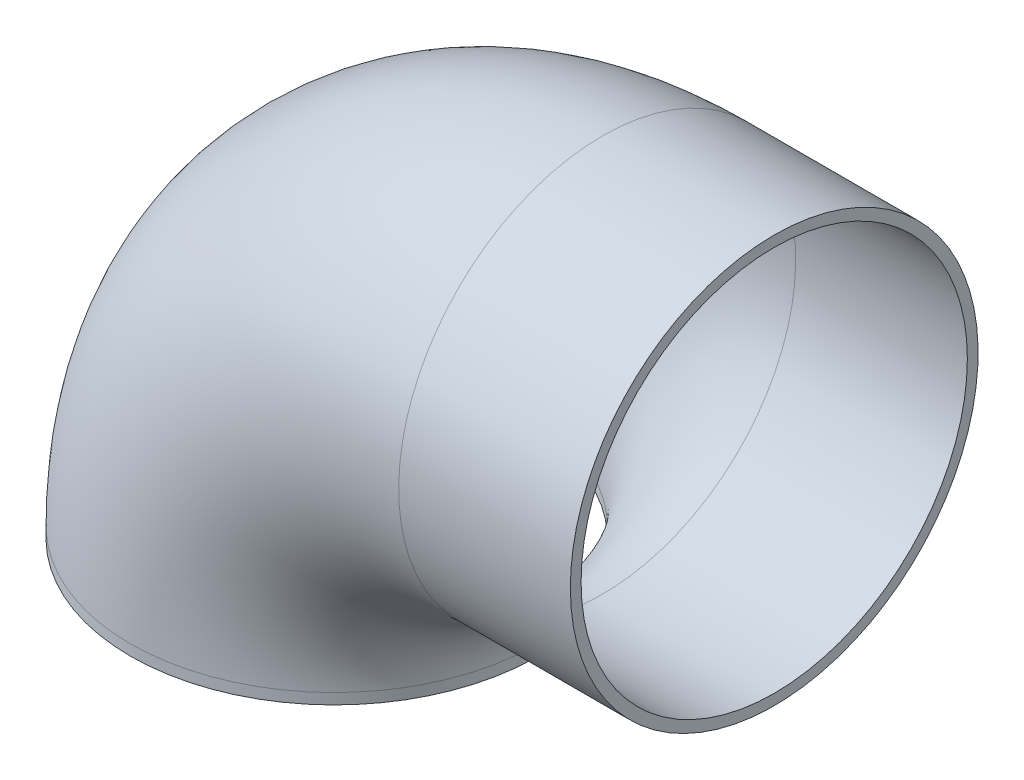
ISO-10303-21;
HEADER;
FILE_DESCRIPTION(('STEP AP214'),'2;1');
FILE_NAME('part.step','',(''),(''),'','','');
FILE_SCHEMA(('AUTOMOTIVE_DESIGN { 1 0 10303 214 1 1 1 1 }'));
ENDSEC;
DATA;
#1=APPLICATION_CONTEXT('core data for automotive mechanical design processes');
#2=APPLICATION_PROTOCOL_DEFINITION('international standard','automotive_design',2000,#1);
#3=PRODUCT_CONTEXT('',#1,'mechanical');
#4=PRODUCT('Part','Part','',(#3));
#5=PRODUCT_RELATED_PRODUCT_CATEGORY('part','',(#4));
#6=PRODUCT_DEFINITION_FORMATION('','',#4);
#7=PRODUCT_DEFINITION_CONTEXT('part definition',#1,'design');
#8=PRODUCT_DEFINITION('design','',#6,#7);
#9=PRODUCT_DEFINITION_SHAPE('','',#8);
#10=(LENGTH_UNIT() NAMED_UNIT(*) SI_UNIT(.MILLI.,.METRE.));
#11=(NAMED_UNIT(*) PLANE_ANGLE_UNIT() SI_UNIT($,.RADIAN.));
#12=(NAMED_UNIT(*) SI_UNIT($,.STERADIAN.) SOLID_ANGLE_UNIT());
#13=UNCERTAINTY_MEASURE_WITH_UNIT(LENGTH_MEASURE(1.E-05),#10,'distance_accuracy_value','');
#14=(GEOMETRIC_REPRESENTATION_CONTEXT(3) GLOBAL_UNCERTAINTY_ASSIGNED_CONTEXT((#13)) GLOBAL_UNIT_ASSIGNED_CONTEXT((#10,
#11,#12)) REPRESENTATION_CONTEXT('',''));
#15=CARTESIAN_POINT('',(0.,0.,0.));
#16=DIRECTION('',(0.,0.,1.));
#17=DIRECTION('',(1.,0.,0.));
#18=AXIS2_PLACEMENT_3D('',#15,#16,#17);
#19=CARTESIAN_POINT('',(0.,0.,0.));
#20=DIRECTION('',(0.,1.,0.));
#21=DIRECTION('',(0.,0.,1.));
#22=AXIS2_PLACEMENT_3D('',#19,#20,#21);
#23=CYLINDRICAL_SURFACE('',#22,38.);
#24=CARTESIAN_POINT('',(0.,1.99999999999999,0.));
#25=DIRECTION('',(0.,1.,0.));
#26=DIRECTION('',(0.,0.,1.));
#27=AXIS2_PLACEMENT_3D('',#24,#25,#26);
#28=CIRCLE('',#27,38.);
#29=CARTESIAN_POINT('',(-38.,1.99999999999999,0.));
#30=VERTEX_POINT('',#29);
#31=EDGE_CURVE('E79',#30,#30,#28,.T.);
#32=ORIENTED_EDGE('',*,*,#31,.F.);
#33=EDGE_LOOP('',(#32));
#34=FACE_BOUND('',#33,.T.);
#35=CARTESIAN_POINT('',(0.,0.,0.));
#36=DIRECTION('',(0.,1.,0.));
#37=DIRECTION('',(0.,0.,1.));
#38=AXIS2_PLACEMENT_3D('',#35,#36,#37);
#39=CIRCLE('',#38,38.);
#40=CARTESIAN_POINT('',(0.,0.,38.));
#41=VERTEX_POINT('',#40);
#42=EDGE_CURVE('E48',#41,#41,#39,.T.);
#43=ORIENTED_EDGE('',*,*,#42,.T.);
#44=EDGE_LOOP('',(#43));
#45=FACE_BOUND('',#44,.T.);
#46=ADVANCED_FACE('F33',(#34,#45),#23,.T.);
#47=CARTESIAN_POINT('',(50.,1.99999999999999,0.));
#48=DIRECTION('',(0.,0.,-1.));
#49=DIRECTION('',(-1.,0.,0.));
#50=AXIS2_PLACEMENT_3D('',#47,#48,#49);
#51=TOROIDAL_SURFACE('',#50,50.,38.);
#52=CARTESIAN_POINT('',(50.,52.,0.));
#53=DIRECTION('',(1.,0.,0.));
#54=DIRECTION('',(0.,0.,1.));
#55=AXIS2_PLACEMENT_3D('',#52,#53,#54);
#56=CIRCLE('',#55,38.);
#57=CARTESIAN_POINT('',(50.,90.,0.));
#58=VERTEX_POINT('',#57);
#59=EDGE_CURVE('E37',#58,#58,#56,.T.);
#60=CARTESIAN_POINT('',(50.,1.99999999999999,0.));
#61=DIRECTION('',(0.,0.,-1.));
#62=DIRECTION('',(-1.,0.,0.));
#63=AXIS2_PLACEMENT_3D('',#60,#61,#62);
#64=CIRCLE('',#63,88.);
#65=EDGE_CURVE('',#30,#58,#64,.T.);
#66=ORIENTED_EDGE('',*,*,#31,.T.);
#67=ORIENTED_EDGE('',*,*,#59,.F.);
#68=ORIENTED_EDGE('',*,*,#65,.T.);
#69=ORIENTED_EDGE('',*,*,#65,.F.);
#70=EDGE_LOOP('',(#66,#68,#67,#69));
#71=FACE_BOUND('',#70,.T.);
#72=ADVANCED_FACE('F87',(#71),#51,.T.);
#73=CARTESIAN_POINT('',(50.,52.,0.));
#74=DIRECTION('',(1.,0.,0.));
#75=DIRECTION('',(0.,1.,0.));
#76=AXIS2_PLACEMENT_3D('',#73,#74,#75);
#77=CYLINDRICAL_SURFACE('',#76,38.);
#78=CARTESIAN_POINT('',(82.,52.,0.));
#79=DIRECTION('',(1.,0.,0.));
#80=DIRECTION('',(0.,0.,1.));
#81=AXIS2_PLACEMENT_3D('',#78,#79,#80);
#82=CIRCLE('',#81,38.);
#83=CARTESIAN_POINT('',(82.,52.,38.));
#84=VERTEX_POINT('',#83);
#85=EDGE_CURVE('E53',#84,#84,#82,.T.);
#86=ORIENTED_EDGE('',*,*,#85,.F.);
#87=EDGE_LOOP('',(#86));
#88=FACE_BOUND('',#87,.T.);
#89=ORIENTED_EDGE('',*,*,#59,.T.);
#90=EDGE_LOOP('',(#89));
#91=FACE_BOUND('',#90,.T.);
#92=ADVANCED_FACE('F35',(#88,#91),#77,.T.);
#93=CARTESIAN_POINT('',(0.,0.,0.));
#94=DIRECTION('',(0.,1.,0.));
#95=DIRECTION('',(0.,0.,1.));
#96=AXIS2_PLACEMENT_3D('',#93,#94,#95);
#97=PLANE('',#96);
#98=CARTESIAN_POINT('',(0.,0.,0.));
#99=DIRECTION('',(0.,1.,0.));
#100=DIRECTION('',(0.,0.,1.));
#101=AXIS2_PLACEMENT_3D('',#98,#99,#100);
#102=CIRCLE('',#101,36.);
#103=CARTESIAN_POINT('',(0.,0.,36.));
#104=VERTEX_POINT('',#103);
#105=EDGE_CURVE('E74',#104,#104,#102,.F.);
#106=ORIENTED_EDGE('',*,*,#105,.F.);
#107=EDGE_LOOP('',(#106));
#108=FACE_BOUND('',#107,.T.);
#109=ORIENTED_EDGE('',*,*,#42,.F.);
#110=EDGE_LOOP('',(#109));
#111=FACE_BOUND('',#110,.T.);
#112=ADVANCED_FACE('F93',(#108,#111),#97,.F.);
#113=CARTESIAN_POINT('',(82.,52.,0.));
#114=DIRECTION('',(1.,0.,0.));
#115=DIRECTION('',(0.,0.,1.));
#116=AXIS2_PLACEMENT_3D('',#113,#114,#115);
#117=PLANE('',#116);
#118=CARTESIAN_POINT('',(82.,52.,0.));
#119=DIRECTION('',(1.,0.,0.));
#120=DIRECTION('',(0.,0.,1.));
#121=AXIS2_PLACEMENT_3D('',#118,#119,#120);
#122=CIRCLE('',#121,36.);
#123=CARTESIAN_POINT('',(82.,52.,36.));
#124=VERTEX_POINT('',#123);
#125=EDGE_CURVE('E11',#124,#124,#122,.F.);
#126=ORIENTED_EDGE('',*,*,#125,.T.);
#127=EDGE_LOOP('',(#126));
#128=FACE_BOUND('',#127,.T.);
#129=ORIENTED_EDGE('',*,*,#85,.T.);
#130=EDGE_LOOP('',(#129));
#131=FACE_BOUND('',#130,.T.);
#132=ADVANCED_FACE('F60',(#128,#131),#117,.T.);
#133=CARTESIAN_POINT('',(0.,0.,0.));
#134=DIRECTION('',(0.,1.,0.));
#135=DIRECTION('',(0.,0.,1.));
#136=AXIS2_PLACEMENT_3D('',#133,#134,#135);
#137=CYLINDRICAL_SURFACE('',#136,36.);
#138=CARTESIAN_POINT('',(0.,1.99999999999999,0.));
#139=DIRECTION('',(0.,1.,0.));
#140=DIRECTION('',(0.,0.,1.));
#141=AXIS2_PLACEMENT_3D('',#138,#139,#140);
#142=CIRCLE('',#141,36.);
#143=CARTESIAN_POINT('',(-36.,1.99999999999999,0.));
#144=VERTEX_POINT('',#143);
#145=EDGE_CURVE('E71',#144,#144,#142,.F.);
#146=ORIENTED_EDGE('',*,*,#145,.F.);
#147=EDGE_LOOP('',(#146));
#148=FACE_BOUND('',#147,.T.);
#149=ORIENTED_EDGE('',*,*,#105,.T.);
#150=EDGE_LOOP('',(#149));
#151=FACE_BOUND('',#150,.T.);
#152=ADVANCED_FACE('F101',(#148,#151),#137,.F.);
#153=CARTESIAN_POINT('',(50.,1.99999999999999,0.));
#154=DIRECTION('',(0.,0.,-1.));
#155=DIRECTION('',(-1.,0.,0.));
#156=AXIS2_PLACEMENT_3D('',#153,#154,#155);
#157=TOROIDAL_SURFACE('',#156,50.,36.);
#158=CARTESIAN_POINT('',(50.,52.,0.));
#159=DIRECTION('',(1.,0.,0.));
#160=DIRECTION('',(0.,0.,1.));
#161=AXIS2_PLACEMENT_3D('',#158,#159,#160);
#162=CIRCLE('',#161,36.);
#163=CARTESIAN_POINT('',(50.,88.,0.));
#164=VERTEX_POINT('',#163);
#165=EDGE_CURVE('E42',#164,#164,#162,.F.);
#166=CARTESIAN_POINT('',(50.,1.99999999999999,0.));
#167=DIRECTION('',(0.,0.,-1.));
#168=DIRECTION('',(-1.,0.,0.));
#169=AXIS2_PLACEMENT_3D('',#166,#167,#168);
#170=CIRCLE('',#169,86.);
#171=EDGE_CURVE('',#144,#164,#170,.T.);
#172=ORIENTED_EDGE('',*,*,#145,.T.);
#173=ORIENTED_EDGE('',*,*,#165,.F.);
#174=ORIENTED_EDGE('',*,*,#171,.T.);
#175=ORIENTED_EDGE('',*,*,#171,.F.);
#176=EDGE_LOOP('',(#172,#174,#173,#175));
#177=FACE_BOUND('',#176,.T.);
#178=ADVANCED_FACE('F66',(#177),#157,.F.);
#179=CARTESIAN_POINT('',(50.,52.,0.));
#180=DIRECTION('',(1.,0.,0.));
#181=DIRECTION('',(0.,1.,0.));
#182=AXIS2_PLACEMENT_3D('',#179,#180,#181);
#183=CYLINDRICAL_SURFACE('',#182,36.);
#184=ORIENTED_EDGE('',*,*,#125,.F.);
#185=EDGE_LOOP('',(#184));
#186=FACE_BOUND('',#185,.T.);
#187=ORIENTED_EDGE('',*,*,#165,.T.);
#188=EDGE_LOOP('',(#187));
#189=FACE_BOUND('',#188,.T.);
#190=ADVANCED_FACE('F63',(#186,#189),#183,.F.);
#191=CLOSED_SHELL('',(#46,#72,#92,#112,#132,#152,#178,#190));
#192=MANIFOLD_SOLID_BREP('B2',#191);
#193=ADVANCED_BREP_SHAPE_REPRESENTATION('',(#18,#192),#14);
#194=SHAPE_DEFINITION_REPRESENTATION(#9,#193);
ENDSEC;
END-ISO-10303-21;
